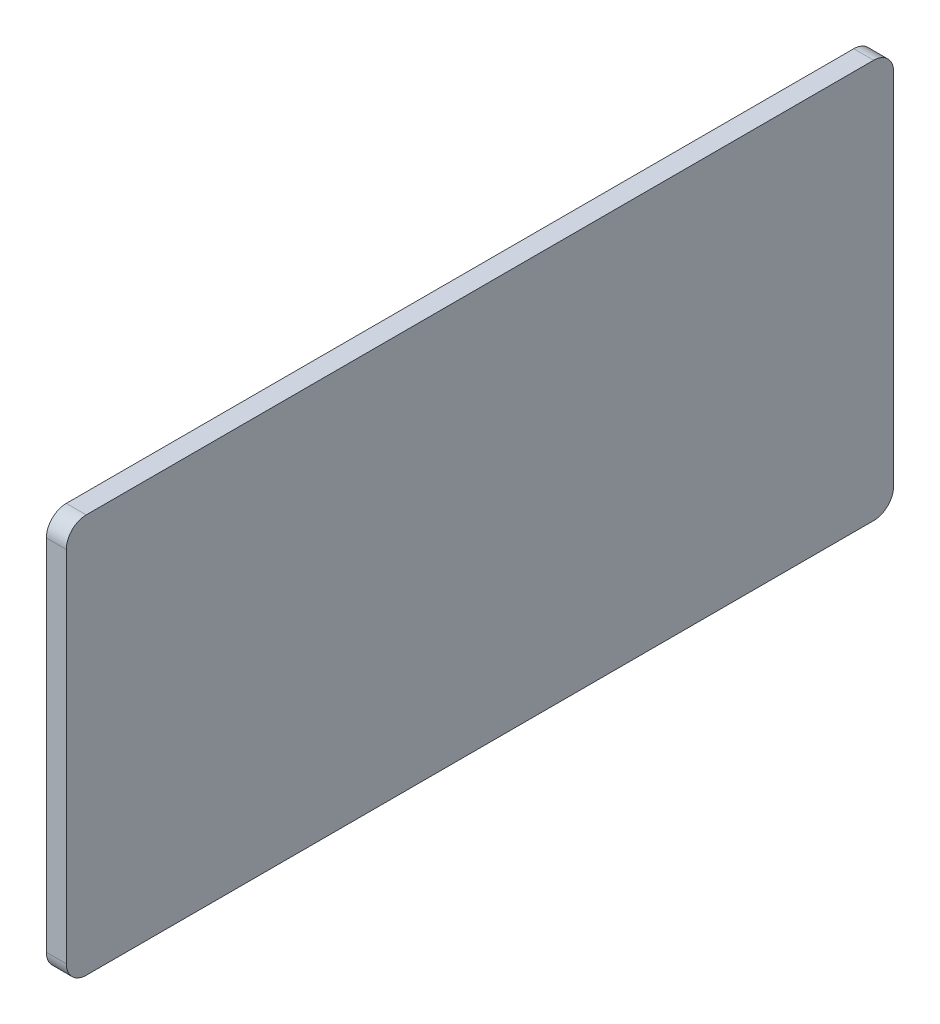
ISO-10303-21;
HEADER;
FILE_DESCRIPTION(('STEP AP214'),'2;1');
FILE_NAME('part.step','',(''),(''),'','','');
FILE_SCHEMA(('AUTOMOTIVE_DESIGN { 1 0 10303 214 1 1 1 1 }'));
ENDSEC;
DATA;
#1=APPLICATION_CONTEXT('core data for automotive mechanical design processes');
#2=APPLICATION_PROTOCOL_DEFINITION('international standard','automotive_design',2000,#1);
#3=PRODUCT_CONTEXT('',#1,'mechanical');
#4=PRODUCT('Part','Part','',(#3));
#5=PRODUCT_RELATED_PRODUCT_CATEGORY('part','',(#4));
#6=PRODUCT_DEFINITION_FORMATION('','',#4);
#7=PRODUCT_DEFINITION_CONTEXT('part definition',#1,'design');
#8=PRODUCT_DEFINITION('design','',#6,#7);
#9=PRODUCT_DEFINITION_SHAPE('','',#8);
#10=(LENGTH_UNIT() NAMED_UNIT(*) SI_UNIT(.MILLI.,.METRE.));
#11=(NAMED_UNIT(*) PLANE_ANGLE_UNIT() SI_UNIT($,.RADIAN.));
#12=(NAMED_UNIT(*) SI_UNIT($,.STERADIAN.) SOLID_ANGLE_UNIT());
#13=UNCERTAINTY_MEASURE_WITH_UNIT(LENGTH_MEASURE(1.E-05),#10,'distance_accuracy_value','');
#14=(GEOMETRIC_REPRESENTATION_CONTEXT(3) GLOBAL_UNCERTAINTY_ASSIGNED_CONTEXT((#13)) GLOBAL_UNIT_ASSIGNED_CONTEXT((#10,
#11,#12)) REPRESENTATION_CONTEXT('',''));
#15=CARTESIAN_POINT('',(0.,0.,0.));
#16=DIRECTION('',(0.,0.,1.));
#17=DIRECTION('',(1.,0.,0.));
#18=AXIS2_PLACEMENT_3D('',#15,#16,#17);
#19=CARTESIAN_POINT('',(2.,-18.,39.5));
#20=DIRECTION('',(-1.,0.,0.));
#21=DIRECTION('',(0.,0.,1.));
#22=AXIS2_PLACEMENT_3D('',#19,#20,#21);
#23=CYLINDRICAL_SURFACE('',#22,2.);
#24=CARTESIAN_POINT('',(0.,-18.,39.5));
#25=DIRECTION('',(1.,0.,0.));
#26=DIRECTION('',(0.,0.,1.));
#27=AXIS2_PLACEMENT_3D('',#24,#25,#26);
#28=CIRCLE('',#27,2.);
#29=CARTESIAN_POINT('',(0.,-18.,41.5));
#30=VERTEX_POINT('',#29);
#31=CARTESIAN_POINT('',(0.,-20.,39.5));
#32=VERTEX_POINT('',#31);
#33=EDGE_CURVE('E140',#30,#32,#28,.T.);
#34=ORIENTED_EDGE('',*,*,#33,.T.);
#35=DIRECTION('',(-1.,0.,0.));
#36=VECTOR('',#35,1.);
#37=CARTESIAN_POINT('',(2.,-20.,39.5));
#38=LINE('',#37,#36);
#39=CARTESIAN_POINT('',(2.,-20.,39.5));
#40=VERTEX_POINT('',#39);
#41=EDGE_CURVE('E11',#40,#32,#38,.T.);
#42=ORIENTED_EDGE('',*,*,#41,.F.);
#43=CARTESIAN_POINT('',(2.,-18.,39.5));
#44=DIRECTION('',(1.,0.,0.));
#45=DIRECTION('',(0.,0.,1.));
#46=AXIS2_PLACEMENT_3D('',#43,#44,#45);
#47=CIRCLE('',#46,2.);
#48=CARTESIAN_POINT('',(2.,-18.,41.5));
#49=VERTEX_POINT('',#48);
#50=EDGE_CURVE('E162',#49,#40,#47,.T.);
#51=ORIENTED_EDGE('',*,*,#50,.F.);
#52=DIRECTION('',(-1.,0.,0.));
#53=VECTOR('',#52,1.);
#54=CARTESIAN_POINT('',(2.,-18.,41.5));
#55=LINE('',#54,#53);
#56=EDGE_CURVE('E136',#49,#30,#55,.T.);
#57=ORIENTED_EDGE('',*,*,#56,.T.);
#58=EDGE_LOOP('',(#34,#42,#51,#57));
#59=FACE_BOUND('',#58,.T.);
#60=ADVANCED_FACE('F39',(#59),#23,.T.);
#61=CARTESIAN_POINT('',(2.,-20.,-39.5));
#62=DIRECTION('',(0.,1.,0.));
#63=DIRECTION('',(0.,0.,1.));
#64=AXIS2_PLACEMENT_3D('',#61,#62,#63);
#65=PLANE('',#64);
#66=DIRECTION('',(0.,0.,-1.));
#67=VECTOR('',#66,1.);
#68=CARTESIAN_POINT('',(0.,-20.,-39.5));
#69=LINE('',#68,#67);
#70=CARTESIAN_POINT('',(0.,-20.,-39.5));
#71=VERTEX_POINT('',#70);
#72=EDGE_CURVE('E144',#32,#71,#69,.T.);
#73=ORIENTED_EDGE('',*,*,#72,.T.);
#74=DIRECTION('',(-1.,0.,0.));
#75=VECTOR('',#74,1.);
#76=CARTESIAN_POINT('',(2.,-20.,-39.5));
#77=LINE('',#76,#75);
#78=CARTESIAN_POINT('',(2.,-20.,-39.5));
#79=VERTEX_POINT('',#78);
#80=EDGE_CURVE('E48',#79,#71,#77,.T.);
#81=ORIENTED_EDGE('',*,*,#80,.F.);
#82=DIRECTION('',(0.,0.,-1.));
#83=VECTOR('',#82,1.);
#84=CARTESIAN_POINT('',(2.,-20.,-39.5));
#85=LINE('',#84,#83);
#86=EDGE_CURVE('E99',#40,#79,#85,.T.);
#87=ORIENTED_EDGE('',*,*,#86,.F.);
#88=ORIENTED_EDGE('',*,*,#41,.T.);
#89=EDGE_LOOP('',(#73,#81,#87,#88));
#90=FACE_BOUND('',#89,.T.);
#91=ADVANCED_FACE('F208',(#90),#65,.F.);
#92=CARTESIAN_POINT('',(2.,-18.,-39.5));
#93=DIRECTION('',(-1.,0.,0.));
#94=DIRECTION('',(0.,0.,1.));
#95=AXIS2_PLACEMENT_3D('',#92,#93,#94);
#96=CYLINDRICAL_SURFACE('',#95,2.);
#97=CARTESIAN_POINT('',(0.,-18.,-39.5));
#98=DIRECTION('',(1.,0.,0.));
#99=DIRECTION('',(0.,0.,-1.));
#100=AXIS2_PLACEMENT_3D('',#97,#98,#99);
#101=CIRCLE('',#100,2.);
#102=CARTESIAN_POINT('',(0.,-18.,-41.5));
#103=VERTEX_POINT('',#102);
#104=EDGE_CURVE('E147',#71,#103,#101,.T.);
#105=ORIENTED_EDGE('',*,*,#104,.T.);
#106=DIRECTION('',(-1.,0.,0.));
#107=VECTOR('',#106,1.);
#108=CARTESIAN_POINT('',(2.,-18.,-41.5));
#109=LINE('',#108,#107);
#110=CARTESIAN_POINT('',(2.,-18.,-41.5));
#111=VERTEX_POINT('',#110);
#112=EDGE_CURVE('E173',#111,#103,#109,.T.);
#113=ORIENTED_EDGE('',*,*,#112,.F.);
#114=CARTESIAN_POINT('',(2.,-18.,-39.5));
#115=DIRECTION('',(1.,0.,0.));
#116=DIRECTION('',(0.,0.,-1.));
#117=AXIS2_PLACEMENT_3D('',#114,#115,#116);
#118=CIRCLE('',#117,2.);
#119=EDGE_CURVE('E183',#79,#111,#118,.T.);
#120=ORIENTED_EDGE('',*,*,#119,.F.);
#121=ORIENTED_EDGE('',*,*,#80,.T.);
#122=EDGE_LOOP('',(#105,#113,#120,#121));
#123=FACE_BOUND('',#122,.T.);
#124=ADVANCED_FACE('F181',(#123),#96,.T.);
#125=CARTESIAN_POINT('',(2.,-18.,-41.5));
#126=DIRECTION('',(0.,0.,1.));
#127=DIRECTION('',(1.,0.,0.));
#128=AXIS2_PLACEMENT_3D('',#125,#126,#127);
#129=PLANE('',#128);
#130=DIRECTION('',(0.,1.,0.));
#131=VECTOR('',#130,1.);
#132=CARTESIAN_POINT('',(0.,-18.,-41.5));
#133=LINE('',#132,#131);
#134=CARTESIAN_POINT('',(0.,18.,-41.5));
#135=VERTEX_POINT('',#134);
#136=EDGE_CURVE('E150',#103,#135,#133,.T.);
#137=ORIENTED_EDGE('',*,*,#136,.T.);
#138=DIRECTION('',(-1.,0.,0.));
#139=VECTOR('',#138,1.);
#140=CARTESIAN_POINT('',(2.,18.,-41.5));
#141=LINE('',#140,#139);
#142=CARTESIAN_POINT('',(2.,18.,-41.5));
#143=VERTEX_POINT('',#142);
#144=EDGE_CURVE('E169',#143,#135,#141,.T.);
#145=ORIENTED_EDGE('',*,*,#144,.F.);
#146=DIRECTION('',(0.,1.,0.));
#147=VECTOR('',#146,1.);
#148=CARTESIAN_POINT('',(2.,-18.,-41.5));
#149=LINE('',#148,#147);
#150=EDGE_CURVE('E196',#111,#143,#149,.T.);
#151=ORIENTED_EDGE('',*,*,#150,.F.);
#152=ORIENTED_EDGE('',*,*,#112,.T.);
#153=EDGE_LOOP('',(#137,#145,#151,#152));
#154=FACE_BOUND('',#153,.T.);
#155=ADVANCED_FACE('F191',(#154),#129,.F.);
#156=CARTESIAN_POINT('',(2.,18.,-39.5));
#157=DIRECTION('',(-1.,0.,0.));
#158=DIRECTION('',(0.,0.,1.));
#159=AXIS2_PLACEMENT_3D('',#156,#157,#158);
#160=CYLINDRICAL_SURFACE('',#159,2.);
#161=CARTESIAN_POINT('',(0.,18.,-39.5));
#162=DIRECTION('',(1.,0.,0.));
#163=DIRECTION('',(0.,0.,-1.));
#164=AXIS2_PLACEMENT_3D('',#161,#162,#163);
#165=CIRCLE('',#164,2.);
#166=CARTESIAN_POINT('',(0.,20.,-39.5));
#167=VERTEX_POINT('',#166);
#168=EDGE_CURVE('E153',#135,#167,#165,.T.);
#169=ORIENTED_EDGE('',*,*,#168,.T.);
#170=DIRECTION('',(-1.,0.,0.));
#171=VECTOR('',#170,1.);
#172=CARTESIAN_POINT('',(2.,20.,-39.5));
#173=LINE('',#172,#171);
#174=CARTESIAN_POINT('',(2.,20.,-39.5));
#175=VERTEX_POINT('',#174);
#176=EDGE_CURVE('E129',#175,#167,#173,.T.);
#177=ORIENTED_EDGE('',*,*,#176,.F.);
#178=CARTESIAN_POINT('',(2.,18.,-39.5));
#179=DIRECTION('',(1.,0.,0.));
#180=DIRECTION('',(0.,0.,-1.));
#181=AXIS2_PLACEMENT_3D('',#178,#179,#180);
#182=CIRCLE('',#181,2.);
#183=EDGE_CURVE('E118',#143,#175,#182,.T.);
#184=ORIENTED_EDGE('',*,*,#183,.F.);
#185=ORIENTED_EDGE('',*,*,#144,.T.);
#186=EDGE_LOOP('',(#169,#177,#184,#185));
#187=FACE_BOUND('',#186,.T.);
#188=ADVANCED_FACE('F194',(#187),#160,.T.);
#189=CARTESIAN_POINT('',(2.,20.,-39.5));
#190=DIRECTION('',(0.,-1.,0.));
#191=DIRECTION('',(0.,0.,-1.));
#192=AXIS2_PLACEMENT_3D('',#189,#190,#191);
#193=PLANE('',#192);
#194=DIRECTION('',(0.,0.,1.));
#195=VECTOR('',#194,1.);
#196=CARTESIAN_POINT('',(0.,20.,-39.5));
#197=LINE('',#196,#195);
#198=CARTESIAN_POINT('',(0.,20.,39.5));
#199=VERTEX_POINT('',#198);
#200=EDGE_CURVE('E127',#167,#199,#197,.T.);
#201=ORIENTED_EDGE('',*,*,#200,.T.);
#202=DIRECTION('',(-1.,0.,0.));
#203=VECTOR('',#202,1.);
#204=CARTESIAN_POINT('',(2.,20.,39.5));
#205=LINE('',#204,#203);
#206=CARTESIAN_POINT('',(2.,20.,39.5));
#207=VERTEX_POINT('',#206);
#208=EDGE_CURVE('E124',#207,#199,#205,.T.);
#209=ORIENTED_EDGE('',*,*,#208,.F.);
#210=DIRECTION('',(0.,0.,1.));
#211=VECTOR('',#210,1.);
#212=CARTESIAN_POINT('',(2.,20.,-39.5));
#213=LINE('',#212,#211);
#214=EDGE_CURVE('E112',#175,#207,#213,.T.);
#215=ORIENTED_EDGE('',*,*,#214,.F.);
#216=ORIENTED_EDGE('',*,*,#176,.T.);
#217=EDGE_LOOP('',(#201,#209,#215,#216));
#218=FACE_BOUND('',#217,.T.);
#219=ADVANCED_FACE('F125',(#218),#193,.F.);
#220=CARTESIAN_POINT('',(2.,18.,39.5));
#221=DIRECTION('',(-1.,0.,0.));
#222=DIRECTION('',(0.,0.,1.));
#223=AXIS2_PLACEMENT_3D('',#220,#221,#222);
#224=CYLINDRICAL_SURFACE('',#223,2.);
#225=CARTESIAN_POINT('',(0.,18.,39.5));
#226=DIRECTION('',(1.,0.,0.));
#227=DIRECTION('',(0.,0.,-1.));
#228=AXIS2_PLACEMENT_3D('',#225,#226,#227);
#229=CIRCLE('',#228,2.);
#230=CARTESIAN_POINT('',(0.,18.,41.5));
#231=VERTEX_POINT('',#230);
#232=EDGE_CURVE('E85',#199,#231,#229,.T.);
#233=ORIENTED_EDGE('',*,*,#232,.T.);
#234=DIRECTION('',(-1.,0.,0.));
#235=VECTOR('',#234,1.);
#236=CARTESIAN_POINT('',(2.,18.,41.5));
#237=LINE('',#236,#235);
#238=CARTESIAN_POINT('',(2.,18.,41.5));
#239=VERTEX_POINT('',#238);
#240=EDGE_CURVE('E130',#239,#231,#237,.T.);
#241=ORIENTED_EDGE('',*,*,#240,.F.);
#242=CARTESIAN_POINT('',(2.,18.,39.5));
#243=DIRECTION('',(1.,0.,0.));
#244=DIRECTION('',(0.,0.,-1.));
#245=AXIS2_PLACEMENT_3D('',#242,#243,#244);
#246=CIRCLE('',#245,2.);
#247=EDGE_CURVE('E116',#207,#239,#246,.T.);
#248=ORIENTED_EDGE('',*,*,#247,.F.);
#249=ORIENTED_EDGE('',*,*,#208,.T.);
#250=EDGE_LOOP('',(#233,#241,#248,#249));
#251=FACE_BOUND('',#250,.T.);
#252=ADVANCED_FACE('F132',(#251),#224,.T.);
#253=CARTESIAN_POINT('',(2.,-18.,41.5));
#254=DIRECTION('',(0.,0.,-1.));
#255=DIRECTION('',(-1.,0.,0.));
#256=AXIS2_PLACEMENT_3D('',#253,#254,#255);
#257=PLANE('',#256);
#258=DIRECTION('',(0.,-1.,0.));
#259=VECTOR('',#258,1.);
#260=CARTESIAN_POINT('',(0.,-18.,41.5));
#261=LINE('',#260,#259);
#262=EDGE_CURVE('E91',#231,#30,#261,.T.);
#263=ORIENTED_EDGE('',*,*,#262,.T.);
#264=ORIENTED_EDGE('',*,*,#56,.F.);
#265=DIRECTION('',(0.,-1.,0.));
#266=VECTOR('',#265,1.);
#267=CARTESIAN_POINT('',(2.,-18.,41.5));
#268=LINE('',#267,#266);
#269=EDGE_CURVE('E56',#239,#49,#268,.T.);
#270=ORIENTED_EDGE('',*,*,#269,.F.);
#271=ORIENTED_EDGE('',*,*,#240,.T.);
#272=EDGE_LOOP('',(#263,#264,#270,#271));
#273=FACE_BOUND('',#272,.T.);
#274=ADVANCED_FACE('F224',(#273),#257,.F.);
#275=CARTESIAN_POINT('',(2.,-18.,39.5));
#276=DIRECTION('',(-1.,0.,0.));
#277=DIRECTION('',(0.,0.,1.));
#278=AXIS2_PLACEMENT_3D('',#275,#276,#277);
#279=PLANE('',#278);
#280=ORIENTED_EDGE('',*,*,#50,.T.);
#281=ORIENTED_EDGE('',*,*,#86,.T.);
#282=ORIENTED_EDGE('',*,*,#119,.T.);
#283=ORIENTED_EDGE('',*,*,#150,.T.);
#284=ORIENTED_EDGE('',*,*,#183,.T.);
#285=ORIENTED_EDGE('',*,*,#214,.T.);
#286=ORIENTED_EDGE('',*,*,#247,.T.);
#287=ORIENTED_EDGE('',*,*,#269,.T.);
#288=EDGE_LOOP('',(#280,#281,#282,#283,#284,#285,#286,#287));
#289=FACE_BOUND('',#288,.T.);
#290=ADVANCED_FACE('F114',(#289),#279,.F.);
#291=CARTESIAN_POINT('',(0.,-18.,39.5));
#292=DIRECTION('',(-1.,0.,0.));
#293=DIRECTION('',(0.,0.,1.));
#294=AXIS2_PLACEMENT_3D('',#291,#292,#293);
#295=PLANE('',#294);
#296=ORIENTED_EDGE('',*,*,#33,.F.);
#297=ORIENTED_EDGE('',*,*,#262,.F.);
#298=ORIENTED_EDGE('',*,*,#232,.F.);
#299=ORIENTED_EDGE('',*,*,#200,.F.);
#300=ORIENTED_EDGE('',*,*,#168,.F.);
#301=ORIENTED_EDGE('',*,*,#136,.F.);
#302=ORIENTED_EDGE('',*,*,#104,.F.);
#303=ORIENTED_EDGE('',*,*,#72,.F.);
#304=EDGE_LOOP('',(#296,#297,#298,#299,#300,#301,#302,#303));
#305=FACE_BOUND('',#304,.T.);
#306=ADVANCED_FACE('F187',(#305),#295,.T.);
#307=CLOSED_SHELL('',(#60,#91,#124,#155,#188,#219,#252,#274,#290,#306));
#308=MANIFOLD_SOLID_BREP('B2',#307);
#309=ADVANCED_BREP_SHAPE_REPRESENTATION('',(#18,#308),#14);
#310=SHAPE_DEFINITION_REPRESENTATION(#9,#309);
ENDSEC;
END-ISO-10303-21;
